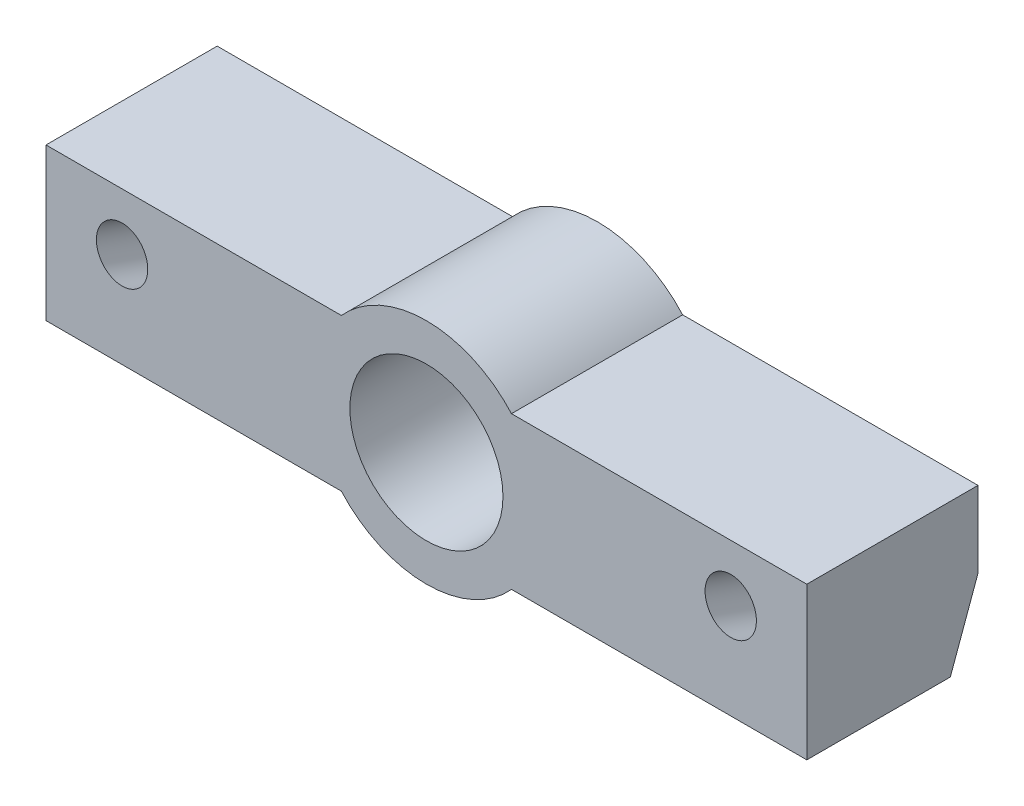
ISO-10303-21;
HEADER;
FILE_DESCRIPTION(('STEP AP214'),'2;1');
FILE_NAME('part.step','',(''),(''),'','','');
FILE_SCHEMA(('AUTOMOTIVE_DESIGN { 1 0 10303 214 1 1 1 1 }'));
ENDSEC;
DATA;
#1=APPLICATION_CONTEXT('core data for automotive mechanical design processes');
#2=APPLICATION_PROTOCOL_DEFINITION('international standard','automotive_design',2000,#1);
#3=PRODUCT_CONTEXT('',#1,'mechanical');
#4=PRODUCT('Part','Part','',(#3));
#5=PRODUCT_RELATED_PRODUCT_CATEGORY('part','',(#4));
#6=PRODUCT_DEFINITION_FORMATION('','',#4);
#7=PRODUCT_DEFINITION_CONTEXT('part definition',#1,'design');
#8=PRODUCT_DEFINITION('design','',#6,#7);
#9=PRODUCT_DEFINITION_SHAPE('','',#8);
#10=(LENGTH_UNIT() NAMED_UNIT(*) SI_UNIT(.MILLI.,.METRE.));
#11=(NAMED_UNIT(*) PLANE_ANGLE_UNIT() SI_UNIT($,.RADIAN.));
#12=(NAMED_UNIT(*) SI_UNIT($,.STERADIAN.) SOLID_ANGLE_UNIT());
#13=UNCERTAINTY_MEASURE_WITH_UNIT(LENGTH_MEASURE(1.E-05),#10,'distance_accuracy_value','');
#14=(GEOMETRIC_REPRESENTATION_CONTEXT(3) GLOBAL_UNCERTAINTY_ASSIGNED_CONTEXT((#13)) GLOBAL_UNIT_ASSIGNED_CONTEXT((#10,
#11,#12)) REPRESENTATION_CONTEXT('',''));
#15=CARTESIAN_POINT('',(0.,0.,0.));
#16=DIRECTION('',(0.,0.,1.));
#17=DIRECTION('',(1.,0.,0.));
#18=AXIS2_PLACEMENT_3D('',#15,#16,#17);
#19=CARTESIAN_POINT('',(-20.,4.,9.));
#20=DIRECTION('',(1.,0.,0.));
#21=DIRECTION('',(0.,0.,-1.));
#22=AXIS2_PLACEMENT_3D('',#19,#20,#21);
#23=PLANE('',#22);
#24=DIRECTION('',(0.,0.93969262078591,-0.342020143325663));
#25=VECTOR('',#24,1.);
#26=CARTESIAN_POINT('',(-20.,0.,0.));
#27=LINE('',#26,#25);
#28=CARTESIAN_POINT('',(-20.,-4.,1.45588093706478));
#29=VERTEX_POINT('',#28);
#30=CARTESIAN_POINT('',(-20.,0.,0.));
#31=VERTEX_POINT('',#30);
#32=EDGE_CURVE('E199',#29,#31,#27,.T.);
#33=ORIENTED_EDGE('',*,*,#32,.F.);
#34=DIRECTION('',(0.,0.,-1.));
#35=VECTOR('',#34,1.);
#36=CARTESIAN_POINT('',(-20.,-4.,9.));
#37=LINE('',#36,#35);
#38=CARTESIAN_POINT('',(-20.,-4.,9.));
#39=VERTEX_POINT('',#38);
#40=EDGE_CURVE('E127',#39,#29,#37,.T.);
#41=ORIENTED_EDGE('',*,*,#40,.F.);
#42=DIRECTION('',(0.,-1.,0.));
#43=VECTOR('',#42,1.);
#44=CARTESIAN_POINT('',(-20.,4.,9.));
#45=LINE('',#44,#43);
#46=CARTESIAN_POINT('',(-20.,4.,9.));
#47=VERTEX_POINT('',#46);
#48=EDGE_CURVE('E64',#47,#39,#45,.T.);
#49=ORIENTED_EDGE('',*,*,#48,.F.);
#50=DIRECTION('',(0.,0.,-1.));
#51=VECTOR('',#50,1.);
#52=CARTESIAN_POINT('',(-20.,4.,9.));
#53=LINE('',#52,#51);
#54=CARTESIAN_POINT('',(-20.,4.,0.));
#55=VERTEX_POINT('',#54);
#56=EDGE_CURVE('E121',#47,#55,#53,.T.);
#57=ORIENTED_EDGE('',*,*,#56,.T.);
#58=DIRECTION('',(0.,-1.,0.));
#59=VECTOR('',#58,1.);
#60=CARTESIAN_POINT('',(-20.,4.,0.));
#61=LINE('',#60,#59);
#62=EDGE_CURVE('E138',#55,#31,#61,.T.);
#63=ORIENTED_EDGE('',*,*,#62,.T.);
#64=EDGE_LOOP('',(#33,#41,#49,#57,#63));
#65=FACE_BOUND('',#64,.T.);
#66=ADVANCED_FACE('F39',(#65),#23,.F.);
#67=CARTESIAN_POINT('',(-4.47213595499958,-4.,9.));
#68=DIRECTION('',(0.,1.,0.));
#69=DIRECTION('',(-1.,0.,0.));
#70=AXIS2_PLACEMENT_3D('',#67,#68,#69);
#71=PLANE('',#70);
#72=ORIENTED_EDGE('',*,*,#40,.T.);
#73=DIRECTION('',(1.,0.,0.));
#74=VECTOR('',#73,1.);
#75=CARTESIAN_POINT('',(-4.47213595499958,-4.,1.45588093706478));
#76=LINE('',#75,#74);
#77=CARTESIAN_POINT('',(-4.47213595499958,-4.,1.45588093706478));
#78=VERTEX_POINT('',#77);
#79=EDGE_CURVE('E164',#29,#78,#76,.T.);
#80=ORIENTED_EDGE('',*,*,#79,.T.);
#81=DIRECTION('',(0.,0.,-1.));
#82=VECTOR('',#81,1.);
#83=CARTESIAN_POINT('',(-4.47213595499958,-4.,9.));
#84=LINE('',#83,#82);
#85=CARTESIAN_POINT('',(-4.47213595499958,-4.,9.));
#86=VERTEX_POINT('',#85);
#87=EDGE_CURVE('E50',#86,#78,#84,.T.);
#88=ORIENTED_EDGE('',*,*,#87,.F.);
#89=DIRECTION('',(1.,0.,0.));
#90=VECTOR('',#89,1.);
#91=CARTESIAN_POINT('',(-4.47213595499958,-4.,9.));
#92=LINE('',#91,#90);
#93=EDGE_CURVE('E145',#39,#86,#92,.T.);
#94=ORIENTED_EDGE('',*,*,#93,.F.);
#95=EDGE_LOOP('',(#72,#80,#88,#94));
#96=FACE_BOUND('',#95,.T.);
#97=ADVANCED_FACE('F41',(#96),#71,.F.);
#98=CARTESIAN_POINT('',(0.,0.,9.));
#99=DIRECTION('',(0.,0.,-1.));
#100=DIRECTION('',(-1.,0.,0.));
#101=AXIS2_PLACEMENT_3D('',#98,#99,#100);
#102=CYLINDRICAL_SURFACE('',#101,6.);
#103=ORIENTED_EDGE('',*,*,#87,.T.);
#104=CARTESIAN_POINT('',(0.,0.,0.));
#105=DIRECTION('',(0.,0.342020143325663,0.93969262078591));
#106=DIRECTION('',(0.,0.939692620785911,-0.342020143325663));
#107=AXIS2_PLACEMENT_3D('',#104,#105,#106);
#108=ELLIPSE('',#107,6.38506663485546,6.);
#109=CARTESIAN_POINT('',(4.47213595499958,-4.,1.45588093706478));
#110=VERTEX_POINT('',#109);
#111=EDGE_CURVE('E160',#78,#110,#108,.T.);
#112=ORIENTED_EDGE('',*,*,#111,.T.);
#113=DIRECTION('',(0.,0.,-1.));
#114=VECTOR('',#113,1.);
#115=CARTESIAN_POINT('',(4.47213595499958,-4.,9.));
#116=LINE('',#115,#114);
#117=CARTESIAN_POINT('',(4.47213595499958,-4.,9.));
#118=VERTEX_POINT('',#117);
#119=EDGE_CURVE('E153',#118,#110,#116,.T.);
#120=ORIENTED_EDGE('',*,*,#119,.F.);
#121=CARTESIAN_POINT('',(0.,0.,9.));
#122=DIRECTION('',(0.,0.,1.));
#123=DIRECTION('',(1.,0.,0.));
#124=AXIS2_PLACEMENT_3D('',#121,#122,#123);
#125=CIRCLE('',#124,6.);
#126=EDGE_CURVE('E94',#86,#118,#125,.T.);
#127=ORIENTED_EDGE('',*,*,#126,.F.);
#128=EDGE_LOOP('',(#103,#112,#120,#127));
#129=FACE_BOUND('',#128,.T.);
#130=ADVANCED_FACE('F157',(#129),#102,.T.);
#131=CARTESIAN_POINT('',(20.,-4.,9.));
#132=DIRECTION('',(0.,1.,0.));
#133=DIRECTION('',(-1.,0.,0.));
#134=AXIS2_PLACEMENT_3D('',#131,#132,#133);
#135=PLANE('',#134);
#136=ORIENTED_EDGE('',*,*,#119,.T.);
#137=DIRECTION('',(1.,0.,0.));
#138=VECTOR('',#137,1.);
#139=CARTESIAN_POINT('',(20.,-4.,1.45588093706478));
#140=LINE('',#139,#138);
#141=CARTESIAN_POINT('',(20.,-4.,1.45588093706478));
#142=VERTEX_POINT('',#141);
#143=EDGE_CURVE('E11',#110,#142,#140,.T.);
#144=ORIENTED_EDGE('',*,*,#143,.T.);
#145=DIRECTION('',(0.,0.,-1.));
#146=VECTOR('',#145,1.);
#147=CARTESIAN_POINT('',(20.,-4.,9.));
#148=LINE('',#147,#146);
#149=CARTESIAN_POINT('',(20.,-4.,9.));
#150=VERTEX_POINT('',#149);
#151=EDGE_CURVE('E146',#150,#142,#148,.T.);
#152=ORIENTED_EDGE('',*,*,#151,.F.);
#153=DIRECTION('',(1.,0.,0.));
#154=VECTOR('',#153,1.);
#155=CARTESIAN_POINT('',(20.,-4.,9.));
#156=LINE('',#155,#154);
#157=EDGE_CURVE('E181',#118,#150,#156,.T.);
#158=ORIENTED_EDGE('',*,*,#157,.F.);
#159=EDGE_LOOP('',(#136,#144,#152,#158));
#160=FACE_BOUND('',#159,.T.);
#161=ADVANCED_FACE('F258',(#160),#135,.F.);
#162=CARTESIAN_POINT('',(20.,4.,9.));
#163=DIRECTION('',(-1.,0.,0.));
#164=DIRECTION('',(0.,0.,1.));
#165=AXIS2_PLACEMENT_3D('',#162,#163,#164);
#166=PLANE('',#165);
#167=ORIENTED_EDGE('',*,*,#151,.T.);
#168=DIRECTION('',(0.,0.93969262078591,-0.342020143325663));
#169=VECTOR('',#168,1.);
#170=CARTESIAN_POINT('',(20.,0.,0.));
#171=LINE('',#170,#169);
#172=CARTESIAN_POINT('',(20.,0.,0.));
#173=VERTEX_POINT('',#172);
#174=EDGE_CURVE('E53',#142,#173,#171,.T.);
#175=ORIENTED_EDGE('',*,*,#174,.T.);
#176=DIRECTION('',(0.,1.,0.));
#177=VECTOR('',#176,1.);
#178=CARTESIAN_POINT('',(20.,4.,0.));
#179=LINE('',#178,#177);
#180=CARTESIAN_POINT('',(20.,4.,0.));
#181=VERTEX_POINT('',#180);
#182=EDGE_CURVE('E135',#173,#181,#179,.T.);
#183=ORIENTED_EDGE('',*,*,#182,.T.);
#184=DIRECTION('',(0.,0.,-1.));
#185=VECTOR('',#184,1.);
#186=CARTESIAN_POINT('',(20.,4.,9.));
#187=LINE('',#186,#185);
#188=CARTESIAN_POINT('',(20.,4.,9.));
#189=VERTEX_POINT('',#188);
#190=EDGE_CURVE('E149',#189,#181,#187,.T.);
#191=ORIENTED_EDGE('',*,*,#190,.F.);
#192=DIRECTION('',(0.,1.,0.));
#193=VECTOR('',#192,1.);
#194=CARTESIAN_POINT('',(20.,4.,9.));
#195=LINE('',#194,#193);
#196=EDGE_CURVE('E182',#150,#189,#195,.T.);
#197=ORIENTED_EDGE('',*,*,#196,.F.);
#198=EDGE_LOOP('',(#167,#175,#183,#191,#197));
#199=FACE_BOUND('',#198,.T.);
#200=ADVANCED_FACE('F186',(#199),#166,.F.);
#201=CARTESIAN_POINT('',(20.,4.,9.));
#202=DIRECTION('',(0.,-1.,0.));
#203=DIRECTION('',(1.,0.,0.));
#204=AXIS2_PLACEMENT_3D('',#201,#202,#203);
#205=PLANE('',#204);
#206=DIRECTION('',(-1.,0.,0.));
#207=VECTOR('',#206,1.);
#208=CARTESIAN_POINT('',(20.,4.,0.));
#209=LINE('',#208,#207);
#210=CARTESIAN_POINT('',(4.47213595499958,4.,0.));
#211=VERTEX_POINT('',#210);
#212=EDGE_CURVE('E132',#181,#211,#209,.T.);
#213=ORIENTED_EDGE('',*,*,#212,.T.);
#214=DIRECTION('',(0.,0.,-1.));
#215=VECTOR('',#214,1.);
#216=CARTESIAN_POINT('',(4.47213595499958,4.,9.));
#217=LINE('',#216,#215);
#218=CARTESIAN_POINT('',(4.47213595499958,4.,9.));
#219=VERTEX_POINT('',#218);
#220=EDGE_CURVE('E124',#219,#211,#217,.T.);
#221=ORIENTED_EDGE('',*,*,#220,.F.);
#222=DIRECTION('',(-1.,0.,0.));
#223=VECTOR('',#222,1.);
#224=CARTESIAN_POINT('',(20.,4.,9.));
#225=LINE('',#224,#223);
#226=EDGE_CURVE('E112',#189,#219,#225,.T.);
#227=ORIENTED_EDGE('',*,*,#226,.F.);
#228=ORIENTED_EDGE('',*,*,#190,.T.);
#229=EDGE_LOOP('',(#213,#221,#227,#228));
#230=FACE_BOUND('',#229,.T.);
#231=ADVANCED_FACE('F192',(#230),#205,.F.);
#232=CARTESIAN_POINT('',(0.,0.,9.));
#233=DIRECTION('',(0.,0.,-1.));
#234=DIRECTION('',(-1.,0.,0.));
#235=AXIS2_PLACEMENT_3D('',#232,#233,#234);
#236=CYLINDRICAL_SURFACE('',#235,6.);
#237=CARTESIAN_POINT('',(0.,0.,0.));
#238=DIRECTION('',(0.,0.,1.));
#239=DIRECTION('',(1.,0.,0.));
#240=AXIS2_PLACEMENT_3D('',#237,#238,#239);
#241=CIRCLE('',#240,6.);
#242=CARTESIAN_POINT('',(-4.47213595499958,4.,0.));
#243=VERTEX_POINT('',#242);
#244=EDGE_CURVE('E125',#211,#243,#241,.T.);
#245=ORIENTED_EDGE('',*,*,#244,.T.);
#246=DIRECTION('',(0.,0.,-1.));
#247=VECTOR('',#246,1.);
#248=CARTESIAN_POINT('',(-4.47213595499958,4.,9.));
#249=LINE('',#248,#247);
#250=CARTESIAN_POINT('',(-4.47213595499958,4.,9.));
#251=VERTEX_POINT('',#250);
#252=EDGE_CURVE('E118',#251,#243,#249,.T.);
#253=ORIENTED_EDGE('',*,*,#252,.F.);
#254=CARTESIAN_POINT('',(0.,0.,9.));
#255=DIRECTION('',(0.,0.,1.));
#256=DIRECTION('',(1.,0.,0.));
#257=AXIS2_PLACEMENT_3D('',#254,#255,#256);
#258=CIRCLE('',#257,6.);
#259=EDGE_CURVE('E108',#219,#251,#258,.T.);
#260=ORIENTED_EDGE('',*,*,#259,.F.);
#261=ORIENTED_EDGE('',*,*,#220,.T.);
#262=EDGE_LOOP('',(#245,#253,#260,#261));
#263=FACE_BOUND('',#262,.T.);
#264=ADVANCED_FACE('F119',(#263),#236,.T.);
#265=CARTESIAN_POINT('',(-4.47213595499958,4.,9.));
#266=DIRECTION('',(0.,-1.,0.));
#267=DIRECTION('',(1.,0.,0.));
#268=AXIS2_PLACEMENT_3D('',#265,#266,#267);
#269=PLANE('',#268);
#270=DIRECTION('',(-1.,0.,0.));
#271=VECTOR('',#270,1.);
#272=CARTESIAN_POINT('',(-4.47213595499958,4.,0.));
#273=LINE('',#272,#271);
#274=EDGE_CURVE('E85',#243,#55,#273,.T.);
#275=ORIENTED_EDGE('',*,*,#274,.T.);
#276=ORIENTED_EDGE('',*,*,#56,.F.);
#277=DIRECTION('',(-1.,0.,0.));
#278=VECTOR('',#277,1.);
#279=CARTESIAN_POINT('',(-4.47213595499958,4.,9.));
#280=LINE('',#279,#278);
#281=EDGE_CURVE('E115',#251,#47,#280,.T.);
#282=ORIENTED_EDGE('',*,*,#281,.F.);
#283=ORIENTED_EDGE('',*,*,#252,.T.);
#284=EDGE_LOOP('',(#275,#276,#282,#283));
#285=FACE_BOUND('',#284,.T.);
#286=ADVANCED_FACE('F128',(#285),#269,.F.);
#287=CARTESIAN_POINT('',(0.,0.,9.));
#288=DIRECTION('',(0.,0.,1.));
#289=DIRECTION('',(1.,0.,0.));
#290=AXIS2_PLACEMENT_3D('',#287,#288,#289);
#291=PLANE('',#290);
#292=CARTESIAN_POINT('',(16.,1.01078344553218,9.));
#293=DIRECTION('',(0.,0.,1.));
#294=DIRECTION('',(0.,-1.,0.));
#295=AXIS2_PLACEMENT_3D('',#292,#293,#294);
#296=ELLIPSE('',#295,1.43663999284247,1.34999999999999);
#297=CARTESIAN_POINT('',(16.,-0.425856547310296,9.));
#298=VERTEX_POINT('',#297);
#299=EDGE_CURVE('E211',#298,#298,#296,.T.);
#300=ORIENTED_EDGE('',*,*,#299,.F.);
#301=EDGE_LOOP('',(#300));
#302=FACE_BOUND('',#301,.T.);
#303=CARTESIAN_POINT('',(-16.,1.01078344553218,9.));
#304=DIRECTION('',(0.,0.,1.));
#305=DIRECTION('',(0.,-1.,0.));
#306=AXIS2_PLACEMENT_3D('',#303,#304,#305);
#307=ELLIPSE('',#306,1.43663999284247,1.34999999999999);
#308=CARTESIAN_POINT('',(-16.,-0.425856547310295,9.));
#309=VERTEX_POINT('',#308);
#310=EDGE_CURVE('E210',#309,#309,#307,.T.);
#311=ORIENTED_EDGE('',*,*,#310,.F.);
#312=EDGE_LOOP('',(#311));
#313=FACE_BOUND('',#312,.T.);
#314=CARTESIAN_POINT('',(0.,0.,9.));
#315=DIRECTION('',(0.,0.,1.));
#316=DIRECTION('',(1.,0.,0.));
#317=AXIS2_PLACEMENT_3D('',#314,#315,#316);
#318=CIRCLE('',#317,4.025);
#319=CARTESIAN_POINT('',(4.025,0.,9.));
#320=VERTEX_POINT('',#319);
#321=EDGE_CURVE('E169',#320,#320,#318,.T.);
#322=ORIENTED_EDGE('',*,*,#321,.F.);
#323=EDGE_LOOP('',(#322));
#324=FACE_BOUND('',#323,.T.);
#325=ORIENTED_EDGE('',*,*,#93,.T.);
#326=ORIENTED_EDGE('',*,*,#126,.T.);
#327=ORIENTED_EDGE('',*,*,#157,.T.);
#328=ORIENTED_EDGE('',*,*,#196,.T.);
#329=ORIENTED_EDGE('',*,*,#226,.T.);
#330=ORIENTED_EDGE('',*,*,#259,.T.);
#331=ORIENTED_EDGE('',*,*,#281,.T.);
#332=ORIENTED_EDGE('',*,*,#48,.T.);
#333=EDGE_LOOP('',(#325,#326,#327,#328,#329,#330,#331,#332));
#334=FACE_BOUND('',#333,.T.);
#335=ADVANCED_FACE('F109',(#302,#313,#324,#334),#291,.T.);
#336=CARTESIAN_POINT('',(0.,0.,0.));
#337=DIRECTION('',(0.,0.,1.));
#338=DIRECTION('',(1.,0.,0.));
#339=AXIS2_PLACEMENT_3D('',#336,#337,#338);
#340=PLANE('',#339);
#341=ORIENTED_EDGE('',*,*,#182,.F.);
#342=DIRECTION('',(-1.,0.,0.));
#343=VECTOR('',#342,1.);
#344=CARTESIAN_POINT('',(20.,0.,0.));
#345=LINE('',#344,#343);
#346=EDGE_CURVE('E173',#173,#31,#345,.T.);
#347=ORIENTED_EDGE('',*,*,#346,.T.);
#348=ORIENTED_EDGE('',*,*,#62,.F.);
#349=ORIENTED_EDGE('',*,*,#274,.F.);
#350=ORIENTED_EDGE('',*,*,#244,.F.);
#351=ORIENTED_EDGE('',*,*,#212,.F.);
#352=EDGE_LOOP('',(#341,#347,#348,#349,#350,#351));
#353=FACE_BOUND('',#352,.T.);
#354=ADVANCED_FACE('F191',(#353),#340,.F.);
#355=CARTESIAN_POINT('',(0.,0.,2.));
#356=DIRECTION('',(0.,0.,1.));
#357=DIRECTION('',(1.,0.,0.));
#358=AXIS2_PLACEMENT_3D('',#355,#356,#357);
#359=CYLINDRICAL_SURFACE('',#358,4.025);
#360=CARTESIAN_POINT('',(0.,0.,2.));
#361=DIRECTION('',(0.,0.,1.));
#362=DIRECTION('',(1.,0.,0.));
#363=AXIS2_PLACEMENT_3D('',#360,#361,#362);
#364=CIRCLE('',#363,4.025);
#365=CARTESIAN_POINT('',(4.025,0.,2.));
#366=VERTEX_POINT('',#365);
#367=EDGE_CURVE('E134',#366,#366,#364,.T.);
#368=ORIENTED_EDGE('',*,*,#367,.F.);
#369=EDGE_LOOP('',(#368));
#370=FACE_BOUND('',#369,.T.);
#371=ORIENTED_EDGE('',*,*,#321,.T.);
#372=EDGE_LOOP('',(#371));
#373=FACE_BOUND('',#372,.T.);
#374=ADVANCED_FACE('F285',(#370,#373),#359,.F.);
#375=CARTESIAN_POINT('',(0.,0.,2.));
#376=DIRECTION('',(0.,0.,1.));
#377=DIRECTION('',(1.,0.,0.));
#378=AXIS2_PLACEMENT_3D('',#375,#376,#377);
#379=PLANE('',#378);
#380=ORIENTED_EDGE('',*,*,#367,.T.);
#381=EDGE_LOOP('',(#380));
#382=FACE_BOUND('',#381,.T.);
#383=ADVANCED_FACE('F227',(#382),#379,.T.);
#384=CARTESIAN_POINT('',(20.,0.,0.));
#385=DIRECTION('',(0.,0.342020143325663,0.93969262078591));
#386=DIRECTION('',(0.,-0.93969262078591,0.342020143325663));
#387=AXIS2_PLACEMENT_3D('',#384,#385,#386);
#388=PLANE('',#387);
#389=CARTESIAN_POINT('',(16.,-2.00000000000001,0.727940468532392));
#390=DIRECTION('',(0.,-0.342020143325663,-0.93969262078591));
#391=DIRECTION('',(0.,0.93969262078591,-0.342020143325663));
#392=AXIS2_PLACEMENT_3D('',#389,#390,#391);
#393=CIRCLE('',#392,1.34999999999999);
#394=CARTESIAN_POINT('',(16.,-0.731414961939036,0.26621327504275));
#395=VERTEX_POINT('',#394);
#396=EDGE_CURVE('E218',#395,#395,#393,.T.);
#397=ORIENTED_EDGE('',*,*,#396,.F.);
#398=EDGE_LOOP('',(#397));
#399=FACE_BOUND('',#398,.T.);
#400=CARTESIAN_POINT('',(-16.,-2.00000000000001,0.727940468532392));
#401=DIRECTION('',(0.,-0.342020143325663,-0.93969262078591));
#402=DIRECTION('',(0.,0.93969262078591,-0.342020143325663));
#403=AXIS2_PLACEMENT_3D('',#400,#401,#402);
#404=CIRCLE('',#403,1.34999999999999);
#405=CARTESIAN_POINT('',(-16.,-0.731414961939038,0.266213275042751));
#406=VERTEX_POINT('',#405);
#407=EDGE_CURVE('E214',#406,#406,#404,.T.);
#408=ORIENTED_EDGE('',*,*,#407,.F.);
#409=EDGE_LOOP('',(#408));
#410=FACE_BOUND('',#409,.T.);
#411=ORIENTED_EDGE('',*,*,#32,.T.);
#412=ORIENTED_EDGE('',*,*,#346,.F.);
#413=ORIENTED_EDGE('',*,*,#174,.F.);
#414=ORIENTED_EDGE('',*,*,#143,.F.);
#415=ORIENTED_EDGE('',*,*,#111,.F.);
#416=ORIENTED_EDGE('',*,*,#79,.F.);
#417=EDGE_LOOP('',(#411,#412,#413,#414,#415,#416));
#418=FACE_BOUND('',#417,.T.);
#419=ADVANCED_FACE('F205',(#399,#410,#418),#388,.F.);
#420=CARTESIAN_POINT('',(-16.,-2.00000000000001,0.727940468532393));
#421=DIRECTION('',(0.,-0.342020143325663,-0.93969262078591));
#422=DIRECTION('',(0.,0.93969262078591,-0.342020143325663));
#423=AXIS2_PLACEMENT_3D('',#420,#421,#422);
#424=CYLINDRICAL_SURFACE('',#423,1.34999999999999);
#425=ORIENTED_EDGE('',*,*,#310,.T.);
#426=EDGE_LOOP('',(#425));
#427=FACE_BOUND('',#426,.T.);
#428=ORIENTED_EDGE('',*,*,#407,.T.);
#429=EDGE_LOOP('',(#428));
#430=FACE_BOUND('',#429,.T.);
#431=ADVANCED_FACE('F228',(#427,#430),#424,.F.);
#432=CARTESIAN_POINT('',(16.,-2.00000000000001,0.727940468532393));
#433=DIRECTION('',(0.,-0.342020143325663,-0.93969262078591));
#434=DIRECTION('',(0.,0.93969262078591,-0.342020143325663));
#435=AXIS2_PLACEMENT_3D('',#432,#433,#434);
#436=CYLINDRICAL_SURFACE('',#435,1.34999999999999);
#437=ORIENTED_EDGE('',*,*,#299,.T.);
#438=EDGE_LOOP('',(#437));
#439=FACE_BOUND('',#438,.T.);
#440=ORIENTED_EDGE('',*,*,#396,.T.);
#441=EDGE_LOOP('',(#440));
#442=FACE_BOUND('',#441,.T.);
#443=ADVANCED_FACE('F222',(#439,#442),#436,.F.);
#444=CLOSED_SHELL('',(#66,#97,#130,#161,#200,#231,#264,#286,#335,#354,#374,#383,#419,#431,#443));
#445=MANIFOLD_SOLID_BREP('B2',#444);
#446=ADVANCED_BREP_SHAPE_REPRESENTATION('',(#18,#445),#14);
#447=SHAPE_DEFINITION_REPRESENTATION(#9,#446);
ENDSEC;
END-ISO-10303-21;
